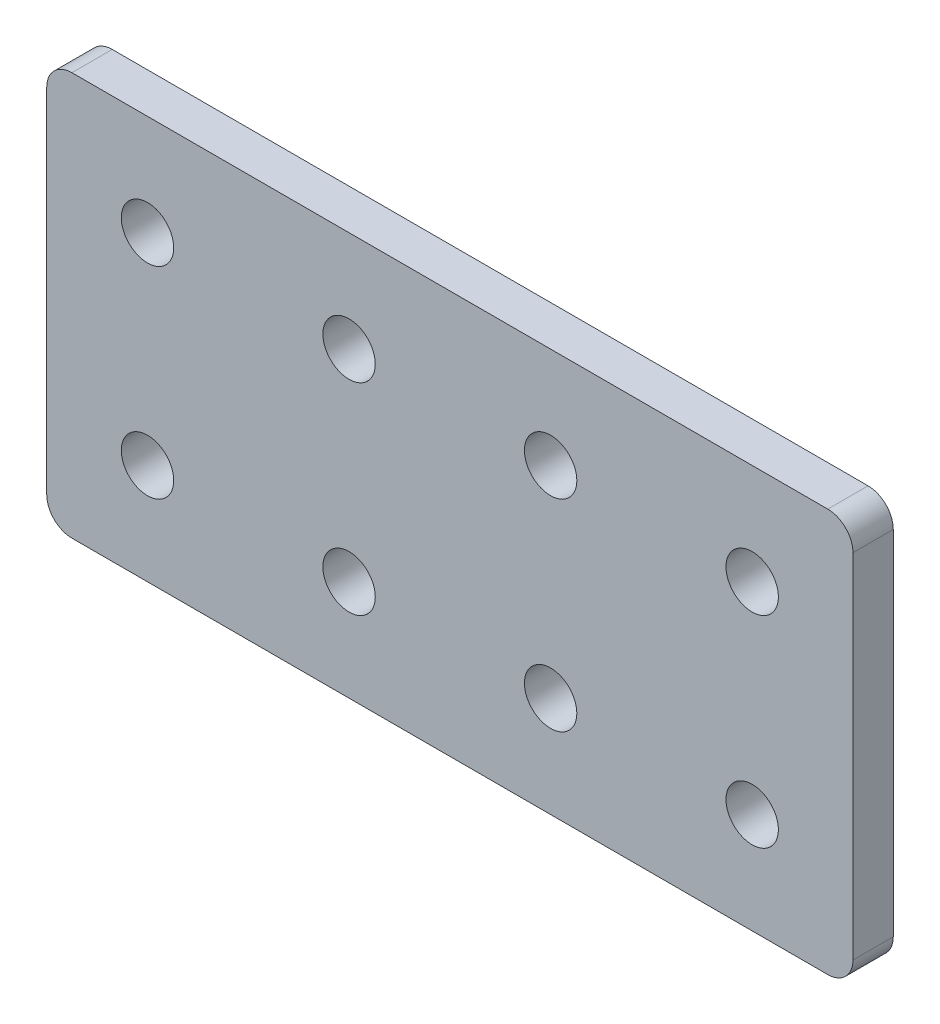
ISO-10303-21;
HEADER;
FILE_DESCRIPTION(('STEP AP214'),'2;1');
FILE_NAME('part.step','',(''),(''),'','','');
FILE_SCHEMA(('AUTOMOTIVE_DESIGN { 1 0 10303 214 1 1 1 1 }'));
ENDSEC;
DATA;
#1=APPLICATION_CONTEXT('core data for automotive mechanical design processes');
#2=APPLICATION_PROTOCOL_DEFINITION('international standard','automotive_design',2000,#1);
#3=PRODUCT_CONTEXT('',#1,'mechanical');
#4=PRODUCT('Part','Part','',(#3));
#5=PRODUCT_RELATED_PRODUCT_CATEGORY('part','',(#4));
#6=PRODUCT_DEFINITION_FORMATION('','',#4);
#7=PRODUCT_DEFINITION_CONTEXT('part definition',#1,'design');
#8=PRODUCT_DEFINITION('design','',#6,#7);
#9=PRODUCT_DEFINITION_SHAPE('','',#8);
#10=(LENGTH_UNIT() NAMED_UNIT(*) SI_UNIT(.MILLI.,.METRE.));
#11=(NAMED_UNIT(*) PLANE_ANGLE_UNIT() SI_UNIT($,.RADIAN.));
#12=(NAMED_UNIT(*) SI_UNIT($,.STERADIAN.) SOLID_ANGLE_UNIT());
#13=UNCERTAINTY_MEASURE_WITH_UNIT(LENGTH_MEASURE(1.E-05),#10,'distance_accuracy_value','');
#14=(GEOMETRIC_REPRESENTATION_CONTEXT(3) GLOBAL_UNCERTAINTY_ASSIGNED_CONTEXT((#13)) GLOBAL_UNIT_ASSIGNED_CONTEXT((#10,
#11,#12)) REPRESENTATION_CONTEXT('',''));
#15=CARTESIAN_POINT('',(0.,0.,0.));
#16=DIRECTION('',(0.,0.,1.));
#17=DIRECTION('',(1.,0.,0.));
#18=AXIS2_PLACEMENT_3D('',#15,#16,#17);
#19=CARTESIAN_POINT('',(77.5,-37.5,4.));
#20=DIRECTION('',(0.,0.,-1.));
#21=DIRECTION('',(-1.,0.,0.));
#22=AXIS2_PLACEMENT_3D('',#19,#20,#21);
#23=PLANE('',#22);
#24=CARTESIAN_POINT('',(77.5,-37.5,4.));
#25=DIRECTION('',(0.,0.,1.));
#26=DIRECTION('',(-1.,0.,0.));
#27=AXIS2_PLACEMENT_3D('',#24,#25,#26);
#28=CIRCLE('',#27,2.5);
#29=CARTESIAN_POINT('',(77.5,-40.,4.));
#30=VERTEX_POINT('',#29);
#31=CARTESIAN_POINT('',(80.,-37.5,4.));
#32=VERTEX_POINT('',#31);
#33=EDGE_CURVE('E148',#30,#32,#28,.T.);
#34=ORIENTED_EDGE('',*,*,#33,.T.);
#35=DIRECTION('',(0.,1.,0.));
#36=VECTOR('',#35,1.);
#37=CARTESIAN_POINT('',(80.,-2.50000000000002,4.));
#38=LINE('',#37,#36);
#39=CARTESIAN_POINT('',(80.,-2.50000000000002,4.));
#40=VERTEX_POINT('',#39);
#41=EDGE_CURVE('E96',#32,#40,#38,.T.);
#42=ORIENTED_EDGE('',*,*,#41,.T.);
#43=CARTESIAN_POINT('',(77.5,-2.5,4.));
#44=DIRECTION('',(0.,0.,1.));
#45=DIRECTION('',(1.,0.,0.));
#46=AXIS2_PLACEMENT_3D('',#43,#44,#45);
#47=CIRCLE('',#46,2.5);
#48=CARTESIAN_POINT('',(77.5,0.,4.));
#49=VERTEX_POINT('',#48);
#50=EDGE_CURVE('E163',#40,#49,#47,.T.);
#51=ORIENTED_EDGE('',*,*,#50,.T.);
#52=DIRECTION('',(-1.,0.,0.));
#53=VECTOR('',#52,1.);
#54=CARTESIAN_POINT('',(2.50000000000002,0.,4.));
#55=LINE('',#54,#53);
#56=CARTESIAN_POINT('',(2.50000000000002,0.,4.));
#57=VERTEX_POINT('',#56);
#58=EDGE_CURVE('E176',#49,#57,#55,.T.);
#59=ORIENTED_EDGE('',*,*,#58,.T.);
#60=CARTESIAN_POINT('',(2.5,-2.5,4.));
#61=DIRECTION('',(0.,0.,1.));
#62=DIRECTION('',(1.,0.,0.));
#63=AXIS2_PLACEMENT_3D('',#60,#61,#62);
#64=CIRCLE('',#63,2.5);
#65=CARTESIAN_POINT('',(0.,-2.50000000000002,4.));
#66=VERTEX_POINT('',#65);
#67=EDGE_CURVE('E115',#57,#66,#64,.T.);
#68=ORIENTED_EDGE('',*,*,#67,.T.);
#69=DIRECTION('',(0.,-1.,0.));
#70=VECTOR('',#69,1.);
#71=CARTESIAN_POINT('',(0.,-2.50000000000002,4.));
#72=LINE('',#71,#70);
#73=CARTESIAN_POINT('',(0.,-37.5,4.));
#74=VERTEX_POINT('',#73);
#75=EDGE_CURVE('E109',#66,#74,#72,.T.);
#76=ORIENTED_EDGE('',*,*,#75,.T.);
#77=CARTESIAN_POINT('',(2.5,-37.5,4.));
#78=DIRECTION('',(0.,0.,1.));
#79=DIRECTION('',(-1.,0.,0.));
#80=AXIS2_PLACEMENT_3D('',#77,#78,#79);
#81=CIRCLE('',#80,2.5);
#82=CARTESIAN_POINT('',(2.50000000000002,-40.,4.));
#83=VERTEX_POINT('',#82);
#84=EDGE_CURVE('E113',#74,#83,#81,.T.);
#85=ORIENTED_EDGE('',*,*,#84,.T.);
#86=DIRECTION('',(1.,0.,0.));
#87=VECTOR('',#86,1.);
#88=CARTESIAN_POINT('',(77.5,-40.,4.));
#89=LINE('',#88,#87);
#90=EDGE_CURVE('E53',#83,#30,#89,.T.);
#91=ORIENTED_EDGE('',*,*,#90,.T.);
#92=EDGE_LOOP('',(#34,#42,#51,#59,#68,#76,#85,#91));
#93=FACE_BOUND('',#92,.T.);
#94=CARTESIAN_POINT('',(30.,-10.,4.));
#95=DIRECTION('',(0.,0.,1.));
#96=DIRECTION('',(1.,0.,0.));
#97=AXIS2_PLACEMENT_3D('',#94,#95,#96);
#98=CIRCLE('',#97,2.6);
#99=CARTESIAN_POINT('',(32.6,-10.,4.));
#100=VERTEX_POINT('',#99);
#101=EDGE_CURVE('E137',#100,#100,#98,.T.);
#102=ORIENTED_EDGE('',*,*,#101,.F.);
#103=EDGE_LOOP('',(#102));
#104=FACE_BOUND('',#103,.T.);
#105=CARTESIAN_POINT('',(50.,-10.,4.));
#106=DIRECTION('',(0.,0.,1.));
#107=DIRECTION('',(1.,0.,0.));
#108=AXIS2_PLACEMENT_3D('',#105,#106,#107);
#109=CIRCLE('',#108,2.6);
#110=CARTESIAN_POINT('',(52.6,-10.,4.));
#111=VERTEX_POINT('',#110);
#112=EDGE_CURVE('E185',#111,#111,#109,.T.);
#113=ORIENTED_EDGE('',*,*,#112,.F.);
#114=EDGE_LOOP('',(#113));
#115=FACE_BOUND('',#114,.T.);
#116=CARTESIAN_POINT('',(70.,-10.,4.));
#117=DIRECTION('',(0.,0.,1.));
#118=DIRECTION('',(1.,0.,0.));
#119=AXIS2_PLACEMENT_3D('',#116,#117,#118);
#120=CIRCLE('',#119,2.6);
#121=CARTESIAN_POINT('',(72.6,-10.,4.));
#122=VERTEX_POINT('',#121);
#123=EDGE_CURVE('E191',#122,#122,#120,.T.);
#124=ORIENTED_EDGE('',*,*,#123,.F.);
#125=EDGE_LOOP('',(#124));
#126=FACE_BOUND('',#125,.T.);
#127=CARTESIAN_POINT('',(30.0000000000002,-30.,4.));
#128=DIRECTION('',(0.,0.,1.));
#129=DIRECTION('',(1.,0.,0.));
#130=AXIS2_PLACEMENT_3D('',#127,#128,#129);
#131=CIRCLE('',#130,2.6);
#132=CARTESIAN_POINT('',(32.6000000000002,-30.,4.));
#133=VERTEX_POINT('',#132);
#134=EDGE_CURVE('E197',#133,#133,#131,.T.);
#135=ORIENTED_EDGE('',*,*,#134,.F.);
#136=EDGE_LOOP('',(#135));
#137=FACE_BOUND('',#136,.T.);
#138=CARTESIAN_POINT('',(10.,-10.,4.));
#139=DIRECTION('',(0.,0.,1.));
#140=DIRECTION('',(1.,0.,0.));
#141=AXIS2_PLACEMENT_3D('',#138,#139,#140);
#142=CIRCLE('',#141,2.6);
#143=CARTESIAN_POINT('',(12.6,-10.,4.));
#144=VERTEX_POINT('',#143);
#145=EDGE_CURVE('E203',#144,#144,#142,.T.);
#146=ORIENTED_EDGE('',*,*,#145,.F.);
#147=EDGE_LOOP('',(#146));
#148=FACE_BOUND('',#147,.T.);
#149=CARTESIAN_POINT('',(50.0000000000002,-30.,4.));
#150=DIRECTION('',(0.,0.,1.));
#151=DIRECTION('',(1.,0.,0.));
#152=AXIS2_PLACEMENT_3D('',#149,#150,#151);
#153=CIRCLE('',#152,2.6);
#154=CARTESIAN_POINT('',(52.6000000000002,-30.,4.));
#155=VERTEX_POINT('',#154);
#156=EDGE_CURVE('E209',#155,#155,#153,.T.);
#157=ORIENTED_EDGE('',*,*,#156,.F.);
#158=EDGE_LOOP('',(#157));
#159=FACE_BOUND('',#158,.T.);
#160=CARTESIAN_POINT('',(70.0000000000002,-30.,4.));
#161=DIRECTION('',(0.,0.,1.));
#162=DIRECTION('',(1.,0.,0.));
#163=AXIS2_PLACEMENT_3D('',#160,#161,#162);
#164=CIRCLE('',#163,2.6);
#165=CARTESIAN_POINT('',(72.6000000000002,-30.,4.));
#166=VERTEX_POINT('',#165);
#167=EDGE_CURVE('E215',#166,#166,#164,.T.);
#168=ORIENTED_EDGE('',*,*,#167,.F.);
#169=EDGE_LOOP('',(#168));
#170=FACE_BOUND('',#169,.T.);
#171=CARTESIAN_POINT('',(10.0000000000002,-30.,4.));
#172=DIRECTION('',(0.,0.,1.));
#173=DIRECTION('',(1.,0.,0.));
#174=AXIS2_PLACEMENT_3D('',#171,#172,#173);
#175=CIRCLE('',#174,2.6);
#176=CARTESIAN_POINT('',(12.6000000000002,-30.,4.));
#177=VERTEX_POINT('',#176);
#178=EDGE_CURVE('E221',#177,#177,#175,.T.);
#179=ORIENTED_EDGE('',*,*,#178,.F.);
#180=EDGE_LOOP('',(#179));
#181=FACE_BOUND('',#180,.T.);
#182=ADVANCED_FACE('F36',(#93,#104,#115,#126,#137,#148,#159,#170,#181),#23,.F.);
#183=CARTESIAN_POINT('',(77.5,-37.5,0.));
#184=DIRECTION('',(0.,0.,-1.));
#185=DIRECTION('',(-1.,0.,0.));
#186=AXIS2_PLACEMENT_3D('',#183,#184,#185);
#187=PLANE('',#186);
#188=CARTESIAN_POINT('',(70.0000000000002,-30.,0.));
#189=DIRECTION('',(0.,0.,1.));
#190=DIRECTION('',(1.,0.,0.));
#191=AXIS2_PLACEMENT_3D('',#188,#189,#190);
#192=CIRCLE('',#191,2.6);
#193=CARTESIAN_POINT('',(72.6000000000002,-30.,0.));
#194=VERTEX_POINT('',#193);
#195=EDGE_CURVE('E218',#194,#194,#192,.T.);
#196=ORIENTED_EDGE('',*,*,#195,.T.);
#197=EDGE_LOOP('',(#196));
#198=FACE_BOUND('',#197,.T.);
#199=CARTESIAN_POINT('',(10.,-10.,0.));
#200=DIRECTION('',(0.,0.,1.));
#201=DIRECTION('',(1.,0.,0.));
#202=AXIS2_PLACEMENT_3D('',#199,#200,#201);
#203=CIRCLE('',#202,2.6);
#204=CARTESIAN_POINT('',(12.6,-10.,0.));
#205=VERTEX_POINT('',#204);
#206=EDGE_CURVE('E206',#205,#205,#203,.T.);
#207=ORIENTED_EDGE('',*,*,#206,.T.);
#208=EDGE_LOOP('',(#207));
#209=FACE_BOUND('',#208,.T.);
#210=CARTESIAN_POINT('',(70.,-10.,0.));
#211=DIRECTION('',(0.,0.,1.));
#212=DIRECTION('',(1.,0.,0.));
#213=AXIS2_PLACEMENT_3D('',#210,#211,#212);
#214=CIRCLE('',#213,2.6);
#215=CARTESIAN_POINT('',(72.6,-10.,0.));
#216=VERTEX_POINT('',#215);
#217=EDGE_CURVE('E194',#216,#216,#214,.T.);
#218=ORIENTED_EDGE('',*,*,#217,.T.);
#219=EDGE_LOOP('',(#218));
#220=FACE_BOUND('',#219,.T.);
#221=CARTESIAN_POINT('',(30.,-10.,0.));
#222=DIRECTION('',(0.,0.,1.));
#223=DIRECTION('',(1.,0.,0.));
#224=AXIS2_PLACEMENT_3D('',#221,#222,#223);
#225=CIRCLE('',#224,2.6);
#226=CARTESIAN_POINT('',(32.6,-10.,0.));
#227=VERTEX_POINT('',#226);
#228=EDGE_CURVE('E182',#227,#227,#225,.T.);
#229=ORIENTED_EDGE('',*,*,#228,.T.);
#230=EDGE_LOOP('',(#229));
#231=FACE_BOUND('',#230,.T.);
#232=CARTESIAN_POINT('',(77.5,-37.5,0.));
#233=DIRECTION('',(0.,0.,1.));
#234=DIRECTION('',(-1.,0.,0.));
#235=AXIS2_PLACEMENT_3D('',#232,#233,#234);
#236=CIRCLE('',#235,2.5);
#237=CARTESIAN_POINT('',(77.5,-40.,0.));
#238=VERTEX_POINT('',#237);
#239=CARTESIAN_POINT('',(80.,-37.5,0.));
#240=VERTEX_POINT('',#239);
#241=EDGE_CURVE('E133',#238,#240,#236,.T.);
#242=ORIENTED_EDGE('',*,*,#241,.F.);
#243=DIRECTION('',(1.,0.,0.));
#244=VECTOR('',#243,1.);
#245=CARTESIAN_POINT('',(77.5,-40.,0.));
#246=LINE('',#245,#244);
#247=CARTESIAN_POINT('',(2.50000000000002,-40.,0.));
#248=VERTEX_POINT('',#247);
#249=EDGE_CURVE('E88',#248,#238,#246,.T.);
#250=ORIENTED_EDGE('',*,*,#249,.F.);
#251=CARTESIAN_POINT('',(2.5,-37.5,0.));
#252=DIRECTION('',(0.,0.,1.));
#253=DIRECTION('',(-1.,0.,0.));
#254=AXIS2_PLACEMENT_3D('',#251,#252,#253);
#255=CIRCLE('',#254,2.5);
#256=CARTESIAN_POINT('',(0.,-37.5,0.));
#257=VERTEX_POINT('',#256);
#258=EDGE_CURVE('E82',#257,#248,#255,.T.);
#259=ORIENTED_EDGE('',*,*,#258,.F.);
#260=DIRECTION('',(0.,-1.,0.));
#261=VECTOR('',#260,1.);
#262=CARTESIAN_POINT('',(0.,-2.50000000000002,0.));
#263=LINE('',#262,#261);
#264=CARTESIAN_POINT('',(0.,-2.50000000000002,0.));
#265=VERTEX_POINT('',#264);
#266=EDGE_CURVE('E123',#265,#257,#263,.T.);
#267=ORIENTED_EDGE('',*,*,#266,.F.);
#268=CARTESIAN_POINT('',(2.5,-2.5,0.));
#269=DIRECTION('',(0.,0.,1.));
#270=DIRECTION('',(1.,0.,0.));
#271=AXIS2_PLACEMENT_3D('',#268,#269,#270);
#272=CIRCLE('',#271,2.5);
#273=CARTESIAN_POINT('',(2.50000000000002,0.,0.));
#274=VERTEX_POINT('',#273);
#275=EDGE_CURVE('E143',#274,#265,#272,.T.);
#276=ORIENTED_EDGE('',*,*,#275,.F.);
#277=DIRECTION('',(-1.,0.,0.));
#278=VECTOR('',#277,1.);
#279=CARTESIAN_POINT('',(2.50000000000002,0.,0.));
#280=LINE('',#279,#278);
#281=CARTESIAN_POINT('',(77.5,0.,0.));
#282=VERTEX_POINT('',#281);
#283=EDGE_CURVE('E141',#282,#274,#280,.T.);
#284=ORIENTED_EDGE('',*,*,#283,.F.);
#285=CARTESIAN_POINT('',(77.5,-2.5,0.));
#286=DIRECTION('',(0.,0.,1.));
#287=DIRECTION('',(1.,0.,0.));
#288=AXIS2_PLACEMENT_3D('',#285,#286,#287);
#289=CIRCLE('',#288,2.5);
#290=CARTESIAN_POINT('',(80.,-2.50000000000002,0.));
#291=VERTEX_POINT('',#290);
#292=EDGE_CURVE('E139',#291,#282,#289,.T.);
#293=ORIENTED_EDGE('',*,*,#292,.F.);
#294=DIRECTION('',(0.,1.,0.));
#295=VECTOR('',#294,1.);
#296=CARTESIAN_POINT('',(80.,-2.50000000000002,0.));
#297=LINE('',#296,#295);
#298=EDGE_CURVE('E136',#240,#291,#297,.T.);
#299=ORIENTED_EDGE('',*,*,#298,.F.);
#300=EDGE_LOOP('',(#242,#250,#259,#267,#276,#284,#293,#299));
#301=FACE_BOUND('',#300,.T.);
#302=CARTESIAN_POINT('',(50.,-10.,0.));
#303=DIRECTION('',(0.,0.,1.));
#304=DIRECTION('',(1.,0.,0.));
#305=AXIS2_PLACEMENT_3D('',#302,#303,#304);
#306=CIRCLE('',#305,2.6);
#307=CARTESIAN_POINT('',(52.6,-10.,0.));
#308=VERTEX_POINT('',#307);
#309=EDGE_CURVE('E188',#308,#308,#306,.T.);
#310=ORIENTED_EDGE('',*,*,#309,.T.);
#311=EDGE_LOOP('',(#310));
#312=FACE_BOUND('',#311,.T.);
#313=CARTESIAN_POINT('',(30.0000000000002,-30.,0.));
#314=DIRECTION('',(0.,0.,1.));
#315=DIRECTION('',(1.,0.,0.));
#316=AXIS2_PLACEMENT_3D('',#313,#314,#315);
#317=CIRCLE('',#316,2.6);
#318=CARTESIAN_POINT('',(32.6000000000002,-30.,0.));
#319=VERTEX_POINT('',#318);
#320=EDGE_CURVE('E200',#319,#319,#317,.T.);
#321=ORIENTED_EDGE('',*,*,#320,.T.);
#322=EDGE_LOOP('',(#321));
#323=FACE_BOUND('',#322,.T.);
#324=CARTESIAN_POINT('',(50.0000000000002,-30.,0.));
#325=DIRECTION('',(0.,0.,1.));
#326=DIRECTION('',(1.,0.,0.));
#327=AXIS2_PLACEMENT_3D('',#324,#325,#326);
#328=CIRCLE('',#327,2.6);
#329=CARTESIAN_POINT('',(52.6000000000002,-30.,0.));
#330=VERTEX_POINT('',#329);
#331=EDGE_CURVE('E212',#330,#330,#328,.T.);
#332=ORIENTED_EDGE('',*,*,#331,.T.);
#333=EDGE_LOOP('',(#332));
#334=FACE_BOUND('',#333,.T.);
#335=CARTESIAN_POINT('',(10.0000000000002,-30.,0.));
#336=DIRECTION('',(0.,0.,1.));
#337=DIRECTION('',(1.,0.,0.));
#338=AXIS2_PLACEMENT_3D('',#335,#336,#337);
#339=CIRCLE('',#338,2.6);
#340=CARTESIAN_POINT('',(12.6000000000002,-30.,0.));
#341=VERTEX_POINT('',#340);
#342=EDGE_CURVE('E224',#341,#341,#339,.T.);
#343=ORIENTED_EDGE('',*,*,#342,.T.);
#344=EDGE_LOOP('',(#343));
#345=FACE_BOUND('',#344,.T.);
#346=ADVANCED_FACE('F167',(#198,#209,#220,#231,#301,#312,#323,#334,#345),#187,.T.);
#347=CARTESIAN_POINT('',(77.5,-37.5,4.));
#348=DIRECTION('',(0.,0.,-1.));
#349=DIRECTION('',(-1.,0.,0.));
#350=AXIS2_PLACEMENT_3D('',#347,#348,#349);
#351=CYLINDRICAL_SURFACE('',#350,2.5);
#352=ORIENTED_EDGE('',*,*,#241,.T.);
#353=DIRECTION('',(0.,0.,-1.));
#354=VECTOR('',#353,1.);
#355=CARTESIAN_POINT('',(80.,-37.5,4.));
#356=LINE('',#355,#354);
#357=EDGE_CURVE('E11',#32,#240,#356,.T.);
#358=ORIENTED_EDGE('',*,*,#357,.F.);
#359=ORIENTED_EDGE('',*,*,#33,.F.);
#360=DIRECTION('',(0.,0.,-1.));
#361=VECTOR('',#360,1.);
#362=CARTESIAN_POINT('',(77.5,-40.,4.));
#363=LINE('',#362,#361);
#364=EDGE_CURVE('E129',#30,#238,#363,.T.);
#365=ORIENTED_EDGE('',*,*,#364,.T.);
#366=EDGE_LOOP('',(#352,#358,#359,#365));
#367=FACE_BOUND('',#366,.T.);
#368=ADVANCED_FACE('F38',(#367),#351,.T.);
#369=CARTESIAN_POINT('',(80.,-2.50000000000002,4.));
#370=DIRECTION('',(-1.,0.,0.));
#371=DIRECTION('',(0.,-1.,0.));
#372=AXIS2_PLACEMENT_3D('',#369,#370,#371);
#373=PLANE('',#372);
#374=ORIENTED_EDGE('',*,*,#298,.T.);
#375=DIRECTION('',(0.,0.,-1.));
#376=VECTOR('',#375,1.);
#377=CARTESIAN_POINT('',(80.,-2.50000000000002,4.));
#378=LINE('',#377,#376);
#379=EDGE_CURVE('E45',#40,#291,#378,.T.);
#380=ORIENTED_EDGE('',*,*,#379,.F.);
#381=ORIENTED_EDGE('',*,*,#41,.F.);
#382=ORIENTED_EDGE('',*,*,#357,.T.);
#383=EDGE_LOOP('',(#374,#380,#381,#382));
#384=FACE_BOUND('',#383,.T.);
#385=ADVANCED_FACE('F256',(#384),#373,.F.);
#386=CARTESIAN_POINT('',(77.5,-2.5,4.));
#387=DIRECTION('',(0.,0.,-1.));
#388=DIRECTION('',(-1.,0.,0.));
#389=AXIS2_PLACEMENT_3D('',#386,#387,#388);
#390=CYLINDRICAL_SURFACE('',#389,2.5);
#391=ORIENTED_EDGE('',*,*,#292,.T.);
#392=DIRECTION('',(0.,0.,-1.));
#393=VECTOR('',#392,1.);
#394=CARTESIAN_POINT('',(77.5,0.,4.));
#395=LINE('',#394,#393);
#396=EDGE_CURVE('E155',#49,#282,#395,.T.);
#397=ORIENTED_EDGE('',*,*,#396,.F.);
#398=ORIENTED_EDGE('',*,*,#50,.F.);
#399=ORIENTED_EDGE('',*,*,#379,.T.);
#400=EDGE_LOOP('',(#391,#397,#398,#399));
#401=FACE_BOUND('',#400,.T.);
#402=ADVANCED_FACE('F161',(#401),#390,.T.);
#403=CARTESIAN_POINT('',(2.50000000000002,0.,4.));
#404=DIRECTION('',(0.,-1.,0.));
#405=DIRECTION('',(0.,0.,-1.));
#406=AXIS2_PLACEMENT_3D('',#403,#404,#405);
#407=PLANE('',#406);
#408=ORIENTED_EDGE('',*,*,#283,.T.);
#409=DIRECTION('',(0.,0.,-1.));
#410=VECTOR('',#409,1.);
#411=CARTESIAN_POINT('',(2.50000000000002,0.,4.));
#412=LINE('',#411,#410);
#413=EDGE_CURVE('E152',#57,#274,#412,.T.);
#414=ORIENTED_EDGE('',*,*,#413,.F.);
#415=ORIENTED_EDGE('',*,*,#58,.F.);
#416=ORIENTED_EDGE('',*,*,#396,.T.);
#417=EDGE_LOOP('',(#408,#414,#415,#416));
#418=FACE_BOUND('',#417,.T.);
#419=ADVANCED_FACE('F172',(#418),#407,.F.);
#420=CARTESIAN_POINT('',(2.5,-2.5,4.));
#421=DIRECTION('',(0.,0.,-1.));
#422=DIRECTION('',(-1.,0.,0.));
#423=AXIS2_PLACEMENT_3D('',#420,#421,#422);
#424=CYLINDRICAL_SURFACE('',#423,2.5);
#425=ORIENTED_EDGE('',*,*,#275,.T.);
#426=DIRECTION('',(0.,0.,-1.));
#427=VECTOR('',#426,1.);
#428=CARTESIAN_POINT('',(0.,-2.50000000000002,4.));
#429=LINE('',#428,#427);
#430=EDGE_CURVE('E124',#66,#265,#429,.T.);
#431=ORIENTED_EDGE('',*,*,#430,.F.);
#432=ORIENTED_EDGE('',*,*,#67,.F.);
#433=ORIENTED_EDGE('',*,*,#413,.T.);
#434=EDGE_LOOP('',(#425,#431,#432,#433));
#435=FACE_BOUND('',#434,.T.);
#436=ADVANCED_FACE('F175',(#435),#424,.T.);
#437=CARTESIAN_POINT('',(0.,-2.50000000000002,4.));
#438=DIRECTION('',(1.,0.,0.));
#439=DIRECTION('',(0.,1.,0.));
#440=AXIS2_PLACEMENT_3D('',#437,#438,#439);
#441=PLANE('',#440);
#442=ORIENTED_EDGE('',*,*,#266,.T.);
#443=DIRECTION('',(0.,0.,-1.));
#444=VECTOR('',#443,1.);
#445=CARTESIAN_POINT('',(0.,-37.5,4.));
#446=LINE('',#445,#444);
#447=EDGE_CURVE('E120',#74,#257,#446,.T.);
#448=ORIENTED_EDGE('',*,*,#447,.F.);
#449=ORIENTED_EDGE('',*,*,#75,.F.);
#450=ORIENTED_EDGE('',*,*,#430,.T.);
#451=EDGE_LOOP('',(#442,#448,#449,#450));
#452=FACE_BOUND('',#451,.T.);
#453=ADVANCED_FACE('F121',(#452),#441,.F.);
#454=CARTESIAN_POINT('',(2.5,-37.5,4.));
#455=DIRECTION('',(0.,0.,-1.));
#456=DIRECTION('',(-1.,0.,0.));
#457=AXIS2_PLACEMENT_3D('',#454,#455,#456);
#458=CYLINDRICAL_SURFACE('',#457,2.5);
#459=ORIENTED_EDGE('',*,*,#258,.T.);
#460=DIRECTION('',(0.,0.,-1.));
#461=VECTOR('',#460,1.);
#462=CARTESIAN_POINT('',(2.50000000000002,-40.,4.));
#463=LINE('',#462,#461);
#464=EDGE_CURVE('E125',#83,#248,#463,.T.);
#465=ORIENTED_EDGE('',*,*,#464,.F.);
#466=ORIENTED_EDGE('',*,*,#84,.F.);
#467=ORIENTED_EDGE('',*,*,#447,.T.);
#468=EDGE_LOOP('',(#459,#465,#466,#467));
#469=FACE_BOUND('',#468,.T.);
#470=ADVANCED_FACE('F127',(#469),#458,.T.);
#471=CARTESIAN_POINT('',(77.5,-40.,4.));
#472=DIRECTION('',(0.,1.,0.));
#473=DIRECTION('',(-1.,0.,0.));
#474=AXIS2_PLACEMENT_3D('',#471,#472,#473);
#475=PLANE('',#474);
#476=ORIENTED_EDGE('',*,*,#249,.T.);
#477=ORIENTED_EDGE('',*,*,#364,.F.);
#478=ORIENTED_EDGE('',*,*,#90,.F.);
#479=ORIENTED_EDGE('',*,*,#464,.T.);
#480=EDGE_LOOP('',(#476,#477,#478,#479));
#481=FACE_BOUND('',#480,.T.);
#482=ADVANCED_FACE('F244',(#481),#475,.F.);
#483=CARTESIAN_POINT('',(30.,-10.,4.));
#484=DIRECTION('',(0.,0.,-1.));
#485=DIRECTION('',(-1.,0.,0.));
#486=AXIS2_PLACEMENT_3D('',#483,#484,#485);
#487=CYLINDRICAL_SURFACE('',#486,2.6);
#488=ORIENTED_EDGE('',*,*,#101,.T.);
#489=EDGE_LOOP('',(#488));
#490=FACE_BOUND('',#489,.T.);
#491=ORIENTED_EDGE('',*,*,#228,.F.);
#492=EDGE_LOOP('',(#491));
#493=FACE_BOUND('',#492,.T.);
#494=ADVANCED_FACE('F241',(#490,#493),#487,.F.);
#495=CARTESIAN_POINT('',(50.,-10.,4.));
#496=DIRECTION('',(0.,0.,-1.));
#497=DIRECTION('',(-1.,0.,0.));
#498=AXIS2_PLACEMENT_3D('',#495,#496,#497);
#499=CYLINDRICAL_SURFACE('',#498,2.6);
#500=ORIENTED_EDGE('',*,*,#112,.T.);
#501=EDGE_LOOP('',(#500));
#502=FACE_BOUND('',#501,.T.);
#503=ORIENTED_EDGE('',*,*,#309,.F.);
#504=EDGE_LOOP('',(#503));
#505=FACE_BOUND('',#504,.T.);
#506=ADVANCED_FACE('F320',(#502,#505),#499,.F.);
#507=CARTESIAN_POINT('',(70.,-10.,4.));
#508=DIRECTION('',(0.,0.,-1.));
#509=DIRECTION('',(-1.,0.,0.));
#510=AXIS2_PLACEMENT_3D('',#507,#508,#509);
#511=CYLINDRICAL_SURFACE('',#510,2.6);
#512=ORIENTED_EDGE('',*,*,#123,.T.);
#513=EDGE_LOOP('',(#512));
#514=FACE_BOUND('',#513,.T.);
#515=ORIENTED_EDGE('',*,*,#217,.F.);
#516=EDGE_LOOP('',(#515));
#517=FACE_BOUND('',#516,.T.);
#518=ADVANCED_FACE('F328',(#514,#517),#511,.F.);
#519=CARTESIAN_POINT('',(30.0000000000002,-30.,4.));
#520=DIRECTION('',(0.,0.,-1.));
#521=DIRECTION('',(-1.,0.,0.));
#522=AXIS2_PLACEMENT_3D('',#519,#520,#521);
#523=CYLINDRICAL_SURFACE('',#522,2.6);
#524=ORIENTED_EDGE('',*,*,#134,.T.);
#525=EDGE_LOOP('',(#524));
#526=FACE_BOUND('',#525,.T.);
#527=ORIENTED_EDGE('',*,*,#320,.F.);
#528=EDGE_LOOP('',(#527));
#529=FACE_BOUND('',#528,.T.);
#530=ADVANCED_FACE('F336',(#526,#529),#523,.F.);
#531=CARTESIAN_POINT('',(10.,-10.,4.));
#532=DIRECTION('',(0.,0.,-1.));
#533=DIRECTION('',(-1.,0.,0.));
#534=AXIS2_PLACEMENT_3D('',#531,#532,#533);
#535=CYLINDRICAL_SURFACE('',#534,2.6);
#536=ORIENTED_EDGE('',*,*,#145,.T.);
#537=EDGE_LOOP('',(#536));
#538=FACE_BOUND('',#537,.T.);
#539=ORIENTED_EDGE('',*,*,#206,.F.);
#540=EDGE_LOOP('',(#539));
#541=FACE_BOUND('',#540,.T.);
#542=ADVANCED_FACE('F345',(#538,#541),#535,.F.);
#543=CARTESIAN_POINT('',(50.0000000000002,-30.,4.));
#544=DIRECTION('',(0.,0.,-1.));
#545=DIRECTION('',(-1.,0.,0.));
#546=AXIS2_PLACEMENT_3D('',#543,#544,#545);
#547=CYLINDRICAL_SURFACE('',#546,2.6);
#548=ORIENTED_EDGE('',*,*,#156,.T.);
#549=EDGE_LOOP('',(#548));
#550=FACE_BOUND('',#549,.T.);
#551=ORIENTED_EDGE('',*,*,#331,.F.);
#552=EDGE_LOOP('',(#551));
#553=FACE_BOUND('',#552,.T.);
#554=ADVANCED_FACE('F354',(#550,#553),#547,.F.);
#555=CARTESIAN_POINT('',(70.0000000000002,-30.,4.));
#556=DIRECTION('',(0.,0.,-1.));
#557=DIRECTION('',(-1.,0.,0.));
#558=AXIS2_PLACEMENT_3D('',#555,#556,#557);
#559=CYLINDRICAL_SURFACE('',#558,2.6);
#560=ORIENTED_EDGE('',*,*,#167,.T.);
#561=EDGE_LOOP('',(#560));
#562=FACE_BOUND('',#561,.T.);
#563=ORIENTED_EDGE('',*,*,#195,.F.);
#564=EDGE_LOOP('',(#563));
#565=FACE_BOUND('',#564,.T.);
#566=ADVANCED_FACE('F363',(#562,#565),#559,.F.);
#567=CARTESIAN_POINT('',(10.0000000000002,-30.,4.));
#568=DIRECTION('',(0.,0.,-1.));
#569=DIRECTION('',(-1.,0.,0.));
#570=AXIS2_PLACEMENT_3D('',#567,#568,#569);
#571=CYLINDRICAL_SURFACE('',#570,2.6);
#572=ORIENTED_EDGE('',*,*,#178,.T.);
#573=EDGE_LOOP('',(#572));
#574=FACE_BOUND('',#573,.T.);
#575=ORIENTED_EDGE('',*,*,#342,.F.);
#576=EDGE_LOOP('',(#575));
#577=FACE_BOUND('',#576,.T.);
#578=ADVANCED_FACE('F230',(#574,#577),#571,.F.);
#579=CLOSED_SHELL('',(#182,#346,#368,#385,#402,#419,#436,#453,#470,#482,#494,#506,#518,#530,
#542,#554,#566,#578));
#580=MANIFOLD_SOLID_BREP('B2',#579);
#581=ADVANCED_BREP_SHAPE_REPRESENTATION('',(#18,#580),#14);
#582=SHAPE_DEFINITION_REPRESENTATION(#9,#581);
ENDSEC;
END-ISO-10303-21;
